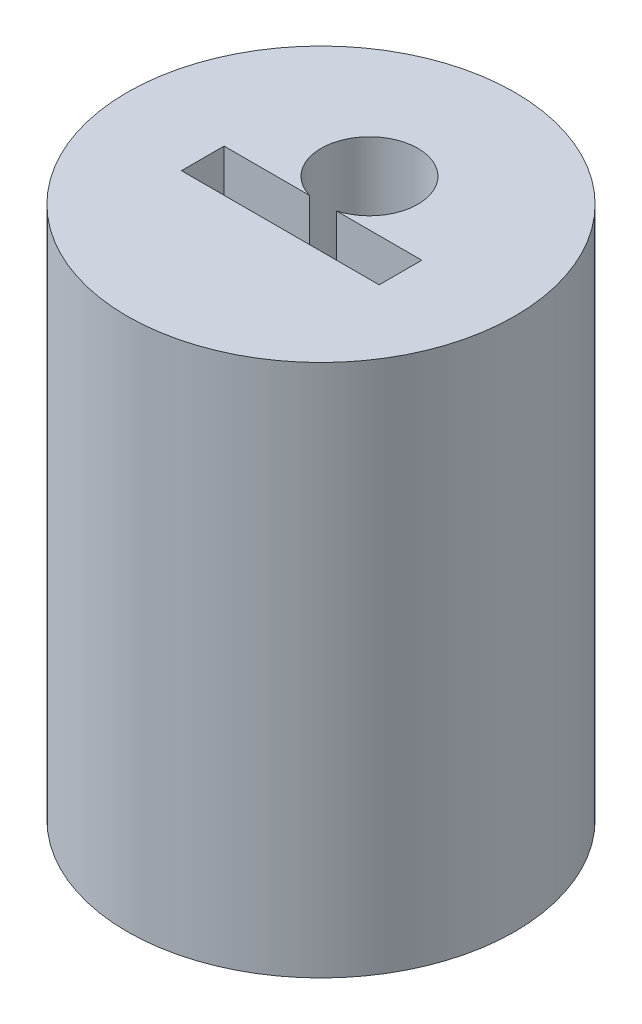
ISO-10303-21;
HEADER;
FILE_DESCRIPTION(('STEP AP214'),'2;1');
FILE_NAME('part.step','',(''),(''),'','','');
FILE_SCHEMA(('AUTOMOTIVE_DESIGN { 1 0 10303 214 1 1 1 1 }'));
ENDSEC;
DATA;
#1=APPLICATION_CONTEXT('core data for automotive mechanical design processes');
#2=APPLICATION_PROTOCOL_DEFINITION('international standard','automotive_design',2000,#1);
#3=PRODUCT_CONTEXT('',#1,'mechanical');
#4=PRODUCT('Part','Part','',(#3));
#5=PRODUCT_RELATED_PRODUCT_CATEGORY('part','',(#4));
#6=PRODUCT_DEFINITION_FORMATION('','',#4);
#7=PRODUCT_DEFINITION_CONTEXT('part definition',#1,'design');
#8=PRODUCT_DEFINITION('design','',#6,#7);
#9=PRODUCT_DEFINITION_SHAPE('','',#8);
#10=(LENGTH_UNIT() NAMED_UNIT(*) SI_UNIT(.MILLI.,.METRE.));
#11=(NAMED_UNIT(*) PLANE_ANGLE_UNIT() SI_UNIT($,.RADIAN.));
#12=(NAMED_UNIT(*) SI_UNIT($,.STERADIAN.) SOLID_ANGLE_UNIT());
#13=UNCERTAINTY_MEASURE_WITH_UNIT(LENGTH_MEASURE(1.E-05),#10,'distance_accuracy_value','');
#14=(GEOMETRIC_REPRESENTATION_CONTEXT(3) GLOBAL_UNCERTAINTY_ASSIGNED_CONTEXT((#13)) GLOBAL_UNIT_ASSIGNED_CONTEXT((#10,
#11,#12)) REPRESENTATION_CONTEXT('',''));
#15=CARTESIAN_POINT('',(0.,0.,0.));
#16=DIRECTION('',(0.,0.,1.));
#17=DIRECTION('',(1.,0.,0.));
#18=AXIS2_PLACEMENT_3D('',#15,#16,#17);
#19=CARTESIAN_POINT('',(0.,1.25,0.));
#20=DIRECTION('',(0.,1.,0.));
#21=DIRECTION('',(0.,0.,1.));
#22=AXIS2_PLACEMENT_3D('',#19,#20,#21);
#23=PLANE('',#22);
#24=CARTESIAN_POINT('',(0.,1.25,0.));
#25=DIRECTION('',(0.,1.,0.));
#26=DIRECTION('',(0.,0.,1.));
#27=AXIS2_PLACEMENT_3D('',#24,#25,#26);
#28=CIRCLE('',#27,1.);
#29=CARTESIAN_POINT('',(0.,1.25,1.));
#30=VERTEX_POINT('',#29);
#31=EDGE_CURVE('E11',#30,#30,#28,.T.);
#32=ORIENTED_EDGE('',*,*,#31,.T.);
#33=EDGE_LOOP('',(#32));
#34=FACE_BOUND('',#33,.T.);
#35=DIRECTION('',(-1.,0.,0.));
#36=VECTOR('',#35,1.);
#37=CARTESIAN_POINT('',(-0.51,1.25,-0.00999999999999992));
#38=LINE('',#37,#36);
#39=CARTESIAN_POINT('',(-0.0699999999999999,1.25,-0.00999999999999992));
#40=VERTEX_POINT('',#39);
#41=CARTESIAN_POINT('',(-0.51,1.25,-0.00999999999999992));
#42=VERTEX_POINT('',#41);
#43=EDGE_CURVE('E104',#40,#42,#38,.T.);
#44=ORIENTED_EDGE('',*,*,#43,.F.);
#45=CARTESIAN_POINT('',(0.,1.25,-0.25));
#46=DIRECTION('',(0.,1.,0.));
#47=DIRECTION('',(0.,0.,1.));
#48=AXIS2_PLACEMENT_3D('',#45,#46,#47);
#49=CIRCLE('',#48,0.25);
#50=CARTESIAN_POINT('',(0.0699999999999997,1.25,-0.00999999999999992));
#51=VERTEX_POINT('',#50);
#52=EDGE_CURVE('E84',#51,#40,#49,.T.);
#53=ORIENTED_EDGE('',*,*,#52,.F.);
#54=DIRECTION('',(-1.,0.,0.));
#55=VECTOR('',#54,1.);
#56=CARTESIAN_POINT('',(0.0699999999999997,1.25,-0.00999999999999992));
#57=LINE('',#56,#55);
#58=CARTESIAN_POINT('',(0.51,1.25,-0.00999999999999991));
#59=VERTEX_POINT('',#58);
#60=EDGE_CURVE('E55',#59,#51,#57,.T.);
#61=ORIENTED_EDGE('',*,*,#60,.F.);
#62=DIRECTION('',(0.,0.,-1.));
#63=VECTOR('',#62,1.);
#64=CARTESIAN_POINT('',(0.51,1.25,0.21));
#65=LINE('',#64,#63);
#66=CARTESIAN_POINT('',(0.51,1.25,0.21));
#67=VERTEX_POINT('',#66);
#68=EDGE_CURVE('E115',#67,#59,#65,.T.);
#69=ORIENTED_EDGE('',*,*,#68,.F.);
#70=DIRECTION('',(1.,0.,0.));
#71=VECTOR('',#70,1.);
#72=CARTESIAN_POINT('',(-0.51,1.25,0.21));
#73=LINE('',#72,#71);
#74=CARTESIAN_POINT('',(-0.51,1.25,0.21));
#75=VERTEX_POINT('',#74);
#76=EDGE_CURVE('E103',#75,#67,#73,.T.);
#77=ORIENTED_EDGE('',*,*,#76,.F.);
#78=DIRECTION('',(0.,0.,1.));
#79=VECTOR('',#78,1.);
#80=CARTESIAN_POINT('',(-0.51,1.25,0.21));
#81=LINE('',#80,#79);
#82=EDGE_CURVE('E93',#42,#75,#81,.T.);
#83=ORIENTED_EDGE('',*,*,#82,.F.);
#84=EDGE_LOOP('',(#44,#53,#61,#69,#77,#83));
#85=FACE_BOUND('',#84,.T.);
#86=ADVANCED_FACE('F34',(#34,#85),#23,.T.);
#87=CARTESIAN_POINT('',(0.,1.25,0.));
#88=DIRECTION('',(0.,-1.,0.));
#89=DIRECTION('',(0.,0.,-1.));
#90=AXIS2_PLACEMENT_3D('',#87,#88,#89);
#91=CYLINDRICAL_SURFACE('',#90,1.);
#92=ORIENTED_EDGE('',*,*,#31,.F.);
#93=EDGE_LOOP('',(#92));
#94=FACE_BOUND('',#93,.T.);
#95=CARTESIAN_POINT('',(0.,-1.5,0.));
#96=DIRECTION('',(0.,-1.,0.));
#97=DIRECTION('',(0.,0.,-1.));
#98=AXIS2_PLACEMENT_3D('',#95,#96,#97);
#99=CIRCLE('',#98,1.);
#100=CARTESIAN_POINT('',(0.,-1.5,-1.));
#101=VERTEX_POINT('',#100);
#102=EDGE_CURVE('E126',#101,#101,#99,.T.);
#103=ORIENTED_EDGE('',*,*,#102,.F.);
#104=EDGE_LOOP('',(#103));
#105=FACE_BOUND('',#104,.T.);
#106=ADVANCED_FACE('F36',(#94,#105),#91,.T.);
#107=CARTESIAN_POINT('',(0.,1.25,-0.25));
#108=DIRECTION('',(0.,-1.,0.));
#109=DIRECTION('',(0.,0.,-1.));
#110=AXIS2_PLACEMENT_3D('',#107,#108,#109);
#111=CYLINDRICAL_SURFACE('',#110,0.25);
#112=CARTESIAN_POINT('',(0.,-1.25,-0.25));
#113=DIRECTION('',(0.,1.,0.));
#114=DIRECTION('',(0.,0.,1.));
#115=AXIS2_PLACEMENT_3D('',#112,#113,#114);
#116=CIRCLE('',#115,0.25);
#117=CARTESIAN_POINT('',(0.0699999999999997,-1.25,-0.00999999999999992));
#118=VERTEX_POINT('',#117);
#119=CARTESIAN_POINT('',(-0.0699999999999999,-1.25,-0.00999999999999992));
#120=VERTEX_POINT('',#119);
#121=EDGE_CURVE('E122',#118,#120,#116,.T.);
#122=ORIENTED_EDGE('',*,*,#121,.F.);
#123=DIRECTION('',(0.,-1.,0.));
#124=VECTOR('',#123,1.);
#125=CARTESIAN_POINT('',(0.0699999999999997,1.25,-0.00999999999999992));
#126=LINE('',#125,#124);
#127=EDGE_CURVE('E121',#51,#118,#126,.T.);
#128=ORIENTED_EDGE('',*,*,#127,.F.);
#129=ORIENTED_EDGE('',*,*,#52,.T.);
#130=DIRECTION('',(0.,-1.,0.));
#131=VECTOR('',#130,1.);
#132=CARTESIAN_POINT('',(-0.0699999999999999,1.25,-0.00999999999999992));
#133=LINE('',#132,#131);
#134=EDGE_CURVE('E42',#40,#120,#133,.T.);
#135=ORIENTED_EDGE('',*,*,#134,.T.);
#136=EDGE_LOOP('',(#122,#128,#129,#135));
#137=FACE_BOUND('',#136,.T.);
#138=ADVANCED_FACE('F142',(#137),#111,.F.);
#139=CARTESIAN_POINT('',(-0.51,1.25,-0.00999999999999992));
#140=DIRECTION('',(0.,0.,1.));
#141=DIRECTION('',(1.,0.,0.));
#142=AXIS2_PLACEMENT_3D('',#139,#140,#141);
#143=PLANE('',#142);
#144=DIRECTION('',(-1.,0.,0.));
#145=VECTOR('',#144,1.);
#146=CARTESIAN_POINT('',(-0.51,-1.25,-0.00999999999999992));
#147=LINE('',#146,#145);
#148=CARTESIAN_POINT('',(-0.51,-1.25,-0.00999999999999992));
#149=VERTEX_POINT('',#148);
#150=EDGE_CURVE('E125',#120,#149,#147,.T.);
#151=ORIENTED_EDGE('',*,*,#150,.F.);
#152=ORIENTED_EDGE('',*,*,#134,.F.);
#153=ORIENTED_EDGE('',*,*,#43,.T.);
#154=DIRECTION('',(0.,-1.,0.));
#155=VECTOR('',#154,1.);
#156=CARTESIAN_POINT('',(-0.51,1.25,-0.00999999999999992));
#157=LINE('',#156,#155);
#158=EDGE_CURVE('E99',#42,#149,#157,.T.);
#159=ORIENTED_EDGE('',*,*,#158,.T.);
#160=EDGE_LOOP('',(#151,#152,#153,#159));
#161=FACE_BOUND('',#160,.T.);
#162=ADVANCED_FACE('F160',(#161),#143,.T.);
#163=CARTESIAN_POINT('',(-0.51,1.25,0.21));
#164=DIRECTION('',(1.,0.,0.));
#165=DIRECTION('',(0.,0.,-1.));
#166=AXIS2_PLACEMENT_3D('',#163,#164,#165);
#167=PLANE('',#166);
#168=DIRECTION('',(0.,0.,1.));
#169=VECTOR('',#168,1.);
#170=CARTESIAN_POINT('',(-0.51,-1.25,0.21));
#171=LINE('',#170,#169);
#172=CARTESIAN_POINT('',(-0.51,-1.25,0.21));
#173=VERTEX_POINT('',#172);
#174=EDGE_CURVE('E129',#149,#173,#171,.T.);
#175=ORIENTED_EDGE('',*,*,#174,.F.);
#176=ORIENTED_EDGE('',*,*,#158,.F.);
#177=ORIENTED_EDGE('',*,*,#82,.T.);
#178=DIRECTION('',(0.,-1.,0.));
#179=VECTOR('',#178,1.);
#180=CARTESIAN_POINT('',(-0.51,1.25,0.21));
#181=LINE('',#180,#179);
#182=EDGE_CURVE('E97',#75,#173,#181,.T.);
#183=ORIENTED_EDGE('',*,*,#182,.T.);
#184=EDGE_LOOP('',(#175,#176,#177,#183));
#185=FACE_BOUND('',#184,.T.);
#186=ADVANCED_FACE('F96',(#185),#167,.T.);
#187=CARTESIAN_POINT('',(-0.51,1.25,0.21));
#188=DIRECTION('',(0.,0.,-1.));
#189=DIRECTION('',(-1.,0.,0.));
#190=AXIS2_PLACEMENT_3D('',#187,#188,#189);
#191=PLANE('',#190);
#192=DIRECTION('',(1.,0.,0.));
#193=VECTOR('',#192,1.);
#194=CARTESIAN_POINT('',(-0.51,-1.25,0.21));
#195=LINE('',#194,#193);
#196=CARTESIAN_POINT('',(0.51,-1.25,0.21));
#197=VERTEX_POINT('',#196);
#198=EDGE_CURVE('E110',#173,#197,#195,.T.);
#199=ORIENTED_EDGE('',*,*,#198,.F.);
#200=ORIENTED_EDGE('',*,*,#182,.F.);
#201=ORIENTED_EDGE('',*,*,#76,.T.);
#202=DIRECTION('',(0.,-1.,0.));
#203=VECTOR('',#202,1.);
#204=CARTESIAN_POINT('',(0.51,1.25,0.21));
#205=LINE('',#204,#203);
#206=EDGE_CURVE('E112',#67,#197,#205,.T.);
#207=ORIENTED_EDGE('',*,*,#206,.T.);
#208=EDGE_LOOP('',(#199,#200,#201,#207));
#209=FACE_BOUND('',#208,.T.);
#210=ADVANCED_FACE('F107',(#209),#191,.T.);
#211=CARTESIAN_POINT('',(0.51,1.25,0.21));
#212=DIRECTION('',(-1.,0.,0.));
#213=DIRECTION('',(0.,0.,1.));
#214=AXIS2_PLACEMENT_3D('',#211,#212,#213);
#215=PLANE('',#214);
#216=DIRECTION('',(0.,0.,-1.));
#217=VECTOR('',#216,1.);
#218=CARTESIAN_POINT('',(0.51,-1.25,0.21));
#219=LINE('',#218,#217);
#220=CARTESIAN_POINT('',(0.51,-1.25,-0.00999999999999991));
#221=VERTEX_POINT('',#220);
#222=EDGE_CURVE('E132',#197,#221,#219,.T.);
#223=ORIENTED_EDGE('',*,*,#222,.F.);
#224=ORIENTED_EDGE('',*,*,#206,.F.);
#225=ORIENTED_EDGE('',*,*,#68,.T.);
#226=DIRECTION('',(0.,-1.,0.));
#227=VECTOR('',#226,1.);
#228=CARTESIAN_POINT('',(0.51,1.25,-0.00999999999999991));
#229=LINE('',#228,#227);
#230=EDGE_CURVE('E49',#59,#221,#229,.T.);
#231=ORIENTED_EDGE('',*,*,#230,.T.);
#232=EDGE_LOOP('',(#223,#224,#225,#231));
#233=FACE_BOUND('',#232,.T.);
#234=ADVANCED_FACE('F173',(#233),#215,.T.);
#235=CARTESIAN_POINT('',(0.0699999999999997,1.25,-0.00999999999999992));
#236=DIRECTION('',(0.,0.,1.));
#237=DIRECTION('',(1.,0.,0.));
#238=AXIS2_PLACEMENT_3D('',#235,#236,#237);
#239=PLANE('',#238);
#240=DIRECTION('',(-1.,0.,0.));
#241=VECTOR('',#240,1.);
#242=CARTESIAN_POINT('',(0.0699999999999997,-1.25,-0.00999999999999992));
#243=LINE('',#242,#241);
#244=EDGE_CURVE('E135',#221,#118,#243,.T.);
#245=ORIENTED_EDGE('',*,*,#244,.F.);
#246=ORIENTED_EDGE('',*,*,#230,.F.);
#247=ORIENTED_EDGE('',*,*,#60,.T.);
#248=ORIENTED_EDGE('',*,*,#127,.T.);
#249=EDGE_LOOP('',(#245,#246,#247,#248));
#250=FACE_BOUND('',#249,.T.);
#251=ADVANCED_FACE('F146',(#250),#239,.T.);
#252=CARTESIAN_POINT('',(0.,-1.25,0.));
#253=DIRECTION('',(0.,-1.,0.));
#254=DIRECTION('',(0.,0.,-1.));
#255=AXIS2_PLACEMENT_3D('',#252,#253,#254);
#256=PLANE('',#255);
#257=ORIENTED_EDGE('',*,*,#121,.T.);
#258=ORIENTED_EDGE('',*,*,#150,.T.);
#259=ORIENTED_EDGE('',*,*,#174,.T.);
#260=ORIENTED_EDGE('',*,*,#198,.T.);
#261=ORIENTED_EDGE('',*,*,#222,.T.);
#262=ORIENTED_EDGE('',*,*,#244,.T.);
#263=EDGE_LOOP('',(#257,#258,#259,#260,#261,#262));
#264=FACE_BOUND('',#263,.T.);
#265=ADVANCED_FACE('F145',(#264),#256,.F.);
#266=CARTESIAN_POINT('',(0.,-1.5,0.));
#267=DIRECTION('',(0.,-1.,0.));
#268=DIRECTION('',(0.,0.,-1.));
#269=AXIS2_PLACEMENT_3D('',#266,#267,#268);
#270=PLANE('',#269);
#271=ORIENTED_EDGE('',*,*,#102,.T.);
#272=EDGE_LOOP('',(#271));
#273=FACE_BOUND('',#272,.T.);
#274=ADVANCED_FACE('F152',(#273),#270,.T.);
#275=CLOSED_SHELL('',(#86,#106,#138,#162,#186,#210,#234,#251,#265,#274));
#276=MANIFOLD_SOLID_BREP('B2',#275);
#277=ADVANCED_BREP_SHAPE_REPRESENTATION('',(#18,#276),#14);
#278=SHAPE_DEFINITION_REPRESENTATION(#9,#277);
ENDSEC;
END-ISO-10303-21;
